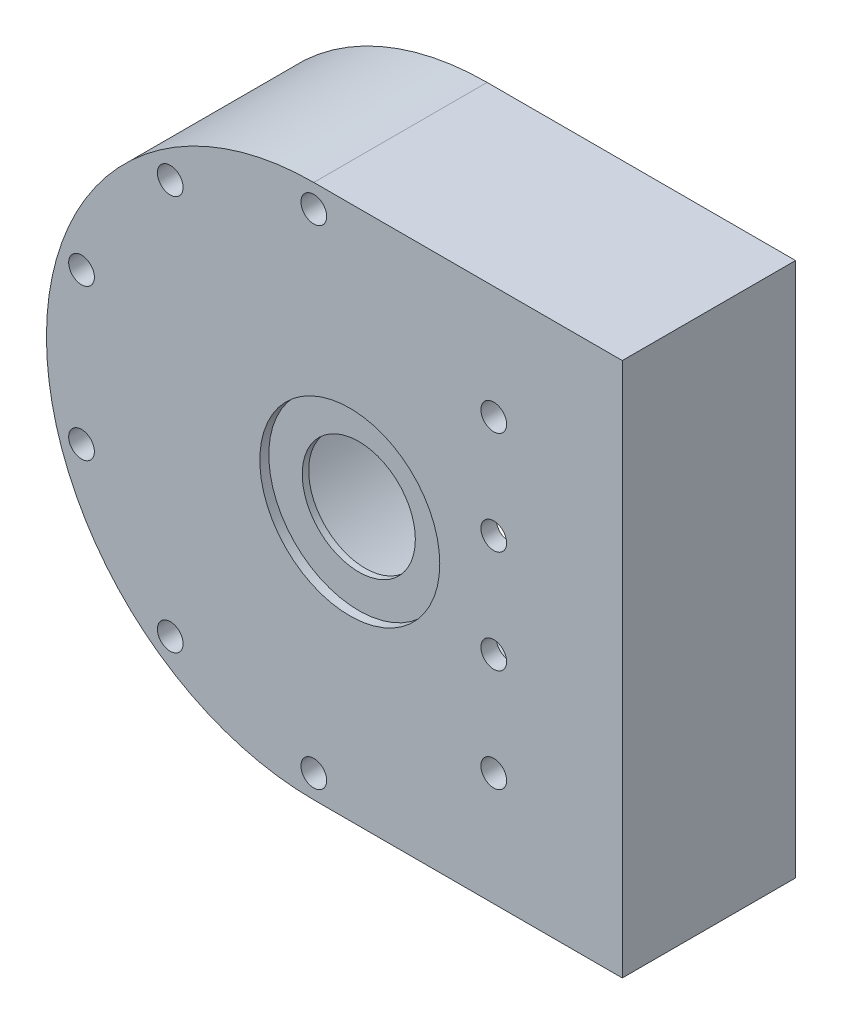
ISO-10303-21;
HEADER;
FILE_DESCRIPTION(('STEP AP214'),'2;1');
FILE_NAME('part.step','',(''),(''),'','','');
FILE_SCHEMA(('AUTOMOTIVE_DESIGN { 1 0 10303 214 1 1 1 1 }'));
ENDSEC;
DATA;
#1=APPLICATION_CONTEXT('core data for automotive mechanical design processes');
#2=APPLICATION_PROTOCOL_DEFINITION('international standard','automotive_design',2000,#1);
#3=PRODUCT_CONTEXT('',#1,'mechanical');
#4=PRODUCT('Part','Part','',(#3));
#5=PRODUCT_RELATED_PRODUCT_CATEGORY('part','',(#4));
#6=PRODUCT_DEFINITION_FORMATION('','',#4);
#7=PRODUCT_DEFINITION_CONTEXT('part definition',#1,'design');
#8=PRODUCT_DEFINITION('design','',#6,#7);
#9=PRODUCT_DEFINITION_SHAPE('','',#8);
#10=(LENGTH_UNIT() NAMED_UNIT(*) SI_UNIT(.MILLI.,.METRE.));
#11=(NAMED_UNIT(*) PLANE_ANGLE_UNIT() SI_UNIT($,.RADIAN.));
#12=(NAMED_UNIT(*) SI_UNIT($,.STERADIAN.) SOLID_ANGLE_UNIT());
#13=UNCERTAINTY_MEASURE_WITH_UNIT(LENGTH_MEASURE(1.E-05),#10,'distance_accuracy_value','');
#14=(GEOMETRIC_REPRESENTATION_CONTEXT(3) GLOBAL_UNCERTAINTY_ASSIGNED_CONTEXT((#13)) GLOBAL_UNIT_ASSIGNED_CONTEXT((#10,
#11,#12)) REPRESENTATION_CONTEXT('',''));
#15=CARTESIAN_POINT('',(0.,0.,0.));
#16=DIRECTION('',(0.,0.,1.));
#17=DIRECTION('',(1.,0.,0.));
#18=AXIS2_PLACEMENT_3D('',#15,#16,#17);
#19=CARTESIAN_POINT('',(7.,0.,30.7));
#20=DIRECTION('',(0.,0.,-1.));
#21=DIRECTION('',(-1.,0.,0.));
#22=AXIS2_PLACEMENT_3D('',#19,#20,#21);
#23=CYLINDRICAL_SURFACE('',#22,30.25);
#24=DIRECTION('',(0.,0.,1.));
#25=VECTOR('',#24,1.);
#26=CARTESIAN_POINT('',(34.5639119198585,-12.4616716243963,16.85));
#27=LINE('',#26,#25);
#28=CARTESIAN_POINT('',(34.5639119198585,-12.4616716243963,0.));
#29=VERTEX_POINT('',#28);
#30=CARTESIAN_POINT('',(34.5639119198585,-12.4616716243963,30.7));
#31=VERTEX_POINT('',#30);
#32=EDGE_CURVE('E49',#29,#31,#27,.T.);
#33=ORIENTED_EDGE('',*,*,#32,.F.);
#34=CARTESIAN_POINT('',(7.,0.,0.));
#35=DIRECTION('',(0.,0.,1.));
#36=DIRECTION('',(1.,0.,0.));
#37=AXIS2_PLACEMENT_3D('',#34,#35,#36);
#38=CIRCLE('',#37,30.25);
#39=CARTESIAN_POINT('',(34.5639119198584,12.4616716243964,0.));
#40=VERTEX_POINT('',#39);
#41=EDGE_CURVE('E113',#40,#29,#38,.T.);
#42=ORIENTED_EDGE('',*,*,#41,.F.);
#43=DIRECTION('',(0.,0.,1.));
#44=VECTOR('',#43,1.);
#45=CARTESIAN_POINT('',(34.5639119198584,12.4616716243964,16.85));
#46=LINE('',#45,#44);
#47=CARTESIAN_POINT('',(34.5639119198584,12.4616716243963,30.7));
#48=VERTEX_POINT('',#47);
#49=EDGE_CURVE('E97',#48,#40,#46,.F.);
#50=ORIENTED_EDGE('',*,*,#49,.F.);
#51=CARTESIAN_POINT('',(7.,0.,30.7));
#52=DIRECTION('',(0.,0.,1.));
#53=DIRECTION('',(1.,0.,0.));
#54=AXIS2_PLACEMENT_3D('',#51,#52,#53);
#55=CIRCLE('',#54,30.25);
#56=EDGE_CURVE('E124',#48,#31,#55,.T.);
#57=ORIENTED_EDGE('',*,*,#56,.T.);
#58=EDGE_LOOP('',(#33,#42,#50,#57));
#59=FACE_BOUND('',#58,.T.);
#60=ADVANCED_FACE('F33',(#59),#23,.F.);
#61=CARTESIAN_POINT('',(7.,0.,33.7));
#62=DIRECTION('',(0.,0.,-1.));
#63=DIRECTION('',(-1.,0.,0.));
#64=AXIS2_PLACEMENT_3D('',#61,#62,#63);
#65=CYLINDRICAL_SURFACE('',#64,11.);
#66=CARTESIAN_POINT('',(7.,0.,30.7));
#67=DIRECTION('',(0.,0.,1.));
#68=DIRECTION('',(1.,0.,0.));
#69=AXIS2_PLACEMENT_3D('',#66,#67,#68);
#70=CIRCLE('',#69,11.);
#71=CARTESIAN_POINT('',(18.,0.,30.7));
#72=VERTEX_POINT('',#71);
#73=EDGE_CURVE('E163',#72,#72,#70,.T.);
#74=ORIENTED_EDGE('',*,*,#73,.F.);
#75=EDGE_LOOP('',(#74));
#76=FACE_BOUND('',#75,.T.);
#77=CARTESIAN_POINT('',(7.,0.,31.95));
#78=DIRECTION('',(0.,0.,1.));
#79=DIRECTION('',(1.,0.,0.));
#80=AXIS2_PLACEMENT_3D('',#77,#78,#79);
#81=CIRCLE('',#80,11.);
#82=CARTESIAN_POINT('',(18.,0.,31.95));
#83=VERTEX_POINT('',#82);
#84=EDGE_CURVE('E37',#83,#83,#81,.T.);
#85=ORIENTED_EDGE('',*,*,#84,.T.);
#86=EDGE_LOOP('',(#85));
#87=FACE_BOUND('',#86,.T.);
#88=ADVANCED_FACE('F210',(#76,#87),#65,.F.);
#89=CARTESIAN_POINT('',(0.,0.,0.));
#90=DIRECTION('',(0.,0.,1.));
#91=DIRECTION('',(1.,0.,0.));
#92=AXIS2_PLACEMENT_3D('',#89,#90,#91);
#93=PLANE('',#92);
#94=CARTESIAN_POINT('',(4.5272699315819E-12,-47.5,0.));
#95=DIRECTION('',(0.,0.,1.));
#96=DIRECTION('',(1.,0.,0.));
#97=AXIS2_PLACEMENT_3D('',#94,#95,#96);
#98=CIRCLE('',#97,2.50000000000401);
#99=CARTESIAN_POINT('',(2.50000000000854,-47.5,0.));
#100=VERTEX_POINT('',#99);
#101=EDGE_CURVE('E318',#100,#100,#98,.T.);
#102=ORIENTED_EDGE('',*,*,#101,.T.);
#103=EDGE_LOOP('',(#102));
#104=FACE_BOUND('',#103,.T.);
#105=CARTESIAN_POINT('',(-27.9197994838875,-38.4283072328107,0.));
#106=DIRECTION('',(0.,0.,1.));
#107=DIRECTION('',(1.,0.,0.));
#108=AXIS2_PLACEMENT_3D('',#105,#106,#107);
#109=CIRCLE('',#108,2.50000000000472);
#110=CARTESIAN_POINT('',(-25.4197994838827,-38.4283072328107,0.));
#111=VERTEX_POINT('',#110);
#112=EDGE_CURVE('E258',#111,#111,#109,.T.);
#113=ORIENTED_EDGE('',*,*,#112,.T.);
#114=EDGE_LOOP('',(#113));
#115=FACE_BOUND('',#114,.T.);
#116=CARTESIAN_POINT('',(-45.1751845240152,-14.6783072328118,0.));
#117=DIRECTION('',(0.,0.,1.));
#118=DIRECTION('',(1.,0.,0.));
#119=AXIS2_PLACEMENT_3D('',#116,#117,#118);
#120=CIRCLE('',#119,2.50000000000396);
#121=CARTESIAN_POINT('',(-42.6751845240112,-14.6783072328118,0.));
#122=VERTEX_POINT('',#121);
#123=EDGE_CURVE('E252',#122,#122,#120,.T.);
#124=ORIENTED_EDGE('',*,*,#123,.T.);
#125=EDGE_LOOP('',(#124));
#126=FACE_BOUND('',#125,.T.);
#127=CARTESIAN_POINT('',(-45.1751845240166,14.6783072328075,0.));
#128=DIRECTION('',(0.,0.,1.));
#129=DIRECTION('',(1.,0.,0.));
#130=AXIS2_PLACEMENT_3D('',#127,#128,#129);
#131=CIRCLE('',#130,2.50000000000231);
#132=CARTESIAN_POINT('',(-42.6751845240143,14.6783072328075,0.));
#133=VERTEX_POINT('',#132);
#134=EDGE_CURVE('E246',#133,#133,#131,.T.);
#135=ORIENTED_EDGE('',*,*,#134,.T.);
#136=EDGE_LOOP('',(#135));
#137=FACE_BOUND('',#136,.T.);
#138=CARTESIAN_POINT('',(-27.9197994838911,38.428307232808,0.));
#139=DIRECTION('',(0.,0.,1.));
#140=DIRECTION('',(1.,0.,0.));
#141=AXIS2_PLACEMENT_3D('',#138,#139,#140);
#142=CIRCLE('',#141,2.5000000000007);
#143=CARTESIAN_POINT('',(-25.4197994838904,38.428307232808,0.));
#144=VERTEX_POINT('',#143);
#145=EDGE_CURVE('E240',#144,#144,#142,.T.);
#146=ORIENTED_EDGE('',*,*,#145,.T.);
#147=EDGE_LOOP('',(#146));
#148=FACE_BOUND('',#147,.T.);
#149=CARTESIAN_POINT('',(0.,47.5,0.));
#150=DIRECTION('',(0.,0.,1.));
#151=DIRECTION('',(1.,0.,0.));
#152=AXIS2_PLACEMENT_3D('',#149,#150,#151);
#153=CIRCLE('',#152,2.5);
#154=CARTESIAN_POINT('',(2.5,47.5,0.));
#155=VERTEX_POINT('',#154);
#156=EDGE_CURVE('E233',#155,#155,#153,.T.);
#157=ORIENTED_EDGE('',*,*,#156,.T.);
#158=EDGE_LOOP('',(#157));
#159=FACE_BOUND('',#158,.T.);
#160=CARTESIAN_POINT('',(35.0000000000006,-30.,0.));
#161=DIRECTION('',(0.,0.,1.));
#162=DIRECTION('',(1.,0.,0.));
#163=AXIS2_PLACEMENT_3D('',#160,#161,#162);
#164=CIRCLE('',#163,2.5);
#165=CARTESIAN_POINT('',(37.5000000000006,-30.,0.));
#166=VERTEX_POINT('',#165);
#167=EDGE_CURVE('E230',#166,#166,#164,.T.);
#168=ORIENTED_EDGE('',*,*,#167,.T.);
#169=EDGE_LOOP('',(#168));
#170=FACE_BOUND('',#169,.T.);
#171=CARTESIAN_POINT('',(35.,30.,0.));
#172=DIRECTION('',(0.,0.,1.));
#173=DIRECTION('',(1.,0.,0.));
#174=AXIS2_PLACEMENT_3D('',#171,#172,#173);
#175=CIRCLE('',#174,2.5);
#176=CARTESIAN_POINT('',(37.5,30.,0.));
#177=VERTEX_POINT('',#176);
#178=EDGE_CURVE('E259',#177,#177,#175,.T.);
#179=ORIENTED_EDGE('',*,*,#178,.T.);
#180=EDGE_LOOP('',(#179));
#181=FACE_BOUND('',#180,.T.);
#182=CARTESIAN_POINT('',(0.,0.,0.));
#183=DIRECTION('',(0.,0.,1.));
#184=DIRECTION('',(1.,0.,0.));
#185=AXIS2_PLACEMENT_3D('',#182,#183,#184);
#186=CIRCLE('',#185,52.);
#187=CARTESIAN_POINT('',(0.,52.,0.));
#188=VERTEX_POINT('',#187);
#189=CARTESIAN_POINT('',(0.,-52.,0.));
#190=VERTEX_POINT('',#189);
#191=EDGE_CURVE('E119',#188,#190,#186,.T.);
#192=ORIENTED_EDGE('',*,*,#191,.F.);
#193=DIRECTION('',(-1.,0.,0.));
#194=VECTOR('',#193,1.);
#195=CARTESIAN_POINT('',(60.,52.,0.));
#196=LINE('',#195,#194);
#197=CARTESIAN_POINT('',(60.,52.,0.));
#198=VERTEX_POINT('',#197);
#199=EDGE_CURVE('E132',#198,#188,#196,.T.);
#200=ORIENTED_EDGE('',*,*,#199,.F.);
#201=DIRECTION('',(0.,1.,0.));
#202=VECTOR('',#201,1.);
#203=CARTESIAN_POINT('',(60.,-52.,0.));
#204=LINE('',#203,#202);
#205=CARTESIAN_POINT('',(60.,-52.,0.));
#206=VERTEX_POINT('',#205);
#207=EDGE_CURVE('E130',#206,#198,#204,.T.);
#208=ORIENTED_EDGE('',*,*,#207,.F.);
#209=DIRECTION('',(1.,0.,0.));
#210=VECTOR('',#209,1.);
#211=CARTESIAN_POINT('',(0.,-52.,0.));
#212=LINE('',#211,#210);
#213=EDGE_CURVE('E122',#190,#206,#212,.T.);
#214=ORIENTED_EDGE('',*,*,#213,.F.);
#215=EDGE_LOOP('',(#192,#200,#208,#214));
#216=FACE_BOUND('',#215,.T.);
#217=ORIENTED_EDGE('',*,*,#41,.T.);
#218=CARTESIAN_POINT('',(35.0000000000004,-10.,0.));
#219=DIRECTION('',(0.,0.,1.));
#220=DIRECTION('',(1.,0.,0.));
#221=AXIS2_PLACEMENT_3D('',#218,#219,#220);
#222=CIRCLE('',#221,2.5);
#223=CARTESIAN_POINT('',(36.2220043697344,-7.81901276474367,0.));
#224=VERTEX_POINT('',#223);
#225=EDGE_CURVE('E224',#29,#224,#222,.T.);
#226=ORIENTED_EDGE('',*,*,#225,.T.);
#227=CARTESIAN_POINT('',(36.2220043697344,7.81901276474376,0.));
#228=VERTEX_POINT('',#227);
#229=EDGE_CURVE('E115',#224,#228,#38,.T.);
#230=ORIENTED_EDGE('',*,*,#229,.T.);
#231=CARTESIAN_POINT('',(35.0000000000002,10.,0.));
#232=DIRECTION('',(0.,0.,1.));
#233=DIRECTION('',(1.,0.,0.));
#234=AXIS2_PLACEMENT_3D('',#231,#232,#233);
#235=CIRCLE('',#234,2.5);
#236=EDGE_CURVE('E101',#228,#40,#235,.T.);
#237=ORIENTED_EDGE('',*,*,#236,.T.);
#238=EDGE_LOOP('',(#217,#226,#230,#237));
#239=FACE_BOUND('',#238,.T.);
#240=ADVANCED_FACE('F111',(#104,#115,#126,#137,#148,#159,#170,#181,#216,#239),#93,.F.);
#241=CARTESIAN_POINT('',(0.,0.,30.7));
#242=DIRECTION('',(0.,0.,-1.));
#243=DIRECTION('',(-1.,0.,0.));
#244=AXIS2_PLACEMENT_3D('',#241,#242,#243);
#245=CYLINDRICAL_SURFACE('',#244,52.);
#246=ORIENTED_EDGE('',*,*,#191,.T.);
#247=DIRECTION('',(0.,0.,-1.));
#248=VECTOR('',#247,1.);
#249=CARTESIAN_POINT('',(0.,-52.,30.7));
#250=LINE('',#249,#248);
#251=CARTESIAN_POINT('',(0.,-52.,33.7));
#252=VERTEX_POINT('',#251);
#253=EDGE_CURVE('E11',#252,#190,#250,.T.);
#254=ORIENTED_EDGE('',*,*,#253,.F.);
#255=CARTESIAN_POINT('',(0.,0.,33.7));
#256=DIRECTION('',(0.,0.,1.));
#257=DIRECTION('',(1.,0.,0.));
#258=AXIS2_PLACEMENT_3D('',#255,#256,#257);
#259=CIRCLE('',#258,52.);
#260=CARTESIAN_POINT('',(0.,52.,33.7));
#261=VERTEX_POINT('',#260);
#262=EDGE_CURVE('E160',#261,#252,#259,.T.);
#263=ORIENTED_EDGE('',*,*,#262,.F.);
#264=DIRECTION('',(0.,0.,-1.));
#265=VECTOR('',#264,1.);
#266=CARTESIAN_POINT('',(0.,52.,30.7));
#267=LINE('',#266,#265);
#268=EDGE_CURVE('E134',#261,#188,#267,.T.);
#269=ORIENTED_EDGE('',*,*,#268,.T.);
#270=EDGE_LOOP('',(#246,#254,#263,#269));
#271=FACE_BOUND('',#270,.T.);
#272=ADVANCED_FACE('F35',(#271),#245,.T.);
#273=CARTESIAN_POINT('',(0.,-52.,30.7));
#274=DIRECTION('',(0.,1.,0.));
#275=DIRECTION('',(0.,0.,1.));
#276=AXIS2_PLACEMENT_3D('',#273,#274,#275);
#277=PLANE('',#276);
#278=ORIENTED_EDGE('',*,*,#213,.T.);
#279=DIRECTION('',(0.,0.,-1.));
#280=VECTOR('',#279,1.);
#281=CARTESIAN_POINT('',(60.,-52.,30.7));
#282=LINE('',#281,#280);
#283=CARTESIAN_POINT('',(60.,-52.,33.7));
#284=VERTEX_POINT('',#283);
#285=EDGE_CURVE('E42',#284,#206,#282,.T.);
#286=ORIENTED_EDGE('',*,*,#285,.F.);
#287=DIRECTION('',(1.,0.,0.));
#288=VECTOR('',#287,1.);
#289=CARTESIAN_POINT('',(0.,-52.,33.7));
#290=LINE('',#289,#288);
#291=EDGE_CURVE('E162',#252,#284,#290,.T.);
#292=ORIENTED_EDGE('',*,*,#291,.F.);
#293=ORIENTED_EDGE('',*,*,#253,.T.);
#294=EDGE_LOOP('',(#278,#286,#292,#293));
#295=FACE_BOUND('',#294,.T.);
#296=ADVANCED_FACE('F352',(#295),#277,.F.);
#297=CARTESIAN_POINT('',(60.,-52.,30.7));
#298=DIRECTION('',(-1.,0.,0.));
#299=DIRECTION('',(0.,0.,1.));
#300=AXIS2_PLACEMENT_3D('',#297,#298,#299);
#301=PLANE('',#300);
#302=ORIENTED_EDGE('',*,*,#207,.T.);
#303=DIRECTION('',(0.,0.,-1.));
#304=VECTOR('',#303,1.);
#305=CARTESIAN_POINT('',(60.,52.,30.7));
#306=LINE('',#305,#304);
#307=CARTESIAN_POINT('',(60.,52.,33.7));
#308=VERTEX_POINT('',#307);
#309=EDGE_CURVE('E137',#308,#198,#306,.T.);
#310=ORIENTED_EDGE('',*,*,#309,.F.);
#311=DIRECTION('',(0.,1.,0.));
#312=VECTOR('',#311,1.);
#313=CARTESIAN_POINT('',(60.,-52.,33.7));
#314=LINE('',#313,#312);
#315=EDGE_CURVE('E146',#284,#308,#314,.T.);
#316=ORIENTED_EDGE('',*,*,#315,.F.);
#317=ORIENTED_EDGE('',*,*,#285,.T.);
#318=EDGE_LOOP('',(#302,#310,#316,#317));
#319=FACE_BOUND('',#318,.T.);
#320=ADVANCED_FACE('F144',(#319),#301,.F.);
#321=CARTESIAN_POINT('',(60.,52.,30.7));
#322=DIRECTION('',(0.,-1.,0.));
#323=DIRECTION('',(0.,0.,-1.));
#324=AXIS2_PLACEMENT_3D('',#321,#322,#323);
#325=PLANE('',#324);
#326=ORIENTED_EDGE('',*,*,#199,.T.);
#327=ORIENTED_EDGE('',*,*,#268,.F.);
#328=DIRECTION('',(-1.,0.,0.));
#329=VECTOR('',#328,1.);
#330=CARTESIAN_POINT('',(60.,52.,33.7));
#331=LINE('',#330,#329);
#332=EDGE_CURVE('E170',#308,#261,#331,.T.);
#333=ORIENTED_EDGE('',*,*,#332,.F.);
#334=ORIENTED_EDGE('',*,*,#309,.T.);
#335=EDGE_LOOP('',(#326,#327,#333,#334));
#336=FACE_BOUND('',#335,.T.);
#337=ADVANCED_FACE('F154',(#336),#325,.F.);
#338=DIRECTION('',(0.,0.,1.));
#339=VECTOR('',#338,1.);
#340=CARTESIAN_POINT('',(36.2220043697344,-7.81901276474367,16.85));
#341=LINE('',#340,#339);
#342=CARTESIAN_POINT('',(36.2220043697344,-7.81901276474368,30.7));
#343=VERTEX_POINT('',#342);
#344=EDGE_CURVE('E178',#343,#224,#341,.F.);
#345=ORIENTED_EDGE('',*,*,#344,.F.);
#346=CARTESIAN_POINT('',(36.2220043697344,7.81901276474378,30.7));
#347=VERTEX_POINT('',#346);
#348=EDGE_CURVE('E126',#343,#347,#55,.T.);
#349=ORIENTED_EDGE('',*,*,#348,.T.);
#350=DIRECTION('',(0.,0.,1.));
#351=VECTOR('',#350,1.);
#352=CARTESIAN_POINT('',(36.2220043697344,7.81901276474376,16.85));
#353=LINE('',#352,#351);
#354=EDGE_CURVE('E57',#228,#347,#353,.T.);
#355=ORIENTED_EDGE('',*,*,#354,.F.);
#356=ORIENTED_EDGE('',*,*,#229,.F.);
#357=EDGE_LOOP('',(#345,#349,#355,#356));
#358=FACE_BOUND('',#357,.T.);
#359=ADVANCED_FACE('F203',(#358),#23,.F.);
#360=CARTESIAN_POINT('',(0.,0.,30.7));
#361=DIRECTION('',(0.,0.,1.));
#362=DIRECTION('',(1.,0.,0.));
#363=AXIS2_PLACEMENT_3D('',#360,#361,#362);
#364=PLANE('',#363);
#365=ORIENTED_EDGE('',*,*,#73,.T.);
#366=EDGE_LOOP('',(#365));
#367=FACE_BOUND('',#366,.T.);
#368=ORIENTED_EDGE('',*,*,#348,.F.);
#369=CARTESIAN_POINT('',(35.0000000000004,-10.,30.7));
#370=DIRECTION('',(0.,0.,1.));
#371=DIRECTION('',(1.,0.,0.));
#372=AXIS2_PLACEMENT_3D('',#369,#370,#371);
#373=CIRCLE('',#372,2.5);
#374=EDGE_CURVE('E177',#343,#31,#373,.T.);
#375=ORIENTED_EDGE('',*,*,#374,.T.);
#376=ORIENTED_EDGE('',*,*,#56,.F.);
#377=CARTESIAN_POINT('',(35.0000000000002,10.,30.7));
#378=DIRECTION('',(0.,0.,1.));
#379=DIRECTION('',(1.,0.,0.));
#380=AXIS2_PLACEMENT_3D('',#377,#378,#379);
#381=CIRCLE('',#380,2.5);
#382=EDGE_CURVE('E102',#48,#347,#381,.T.);
#383=ORIENTED_EDGE('',*,*,#382,.T.);
#384=EDGE_LOOP('',(#368,#375,#376,#383));
#385=FACE_BOUND('',#384,.T.);
#386=ADVANCED_FACE('F176',(#367,#385),#364,.F.);
#387=CARTESIAN_POINT('',(0.,0.,33.7));
#388=DIRECTION('',(0.,0.,1.));
#389=DIRECTION('',(1.,0.,0.));
#390=AXIS2_PLACEMENT_3D('',#387,#388,#389);
#391=PLANE('',#390);
#392=CARTESIAN_POINT('',(35.0000000000004,-10.,33.7));
#393=DIRECTION('',(0.,0.,1.));
#394=DIRECTION('',(1.,0.,0.));
#395=AXIS2_PLACEMENT_3D('',#392,#393,#394);
#396=CIRCLE('',#395,2.5);
#397=CARTESIAN_POINT('',(37.5000000000004,-10.,33.7));
#398=VERTEX_POINT('',#397);
#399=EDGE_CURVE('E225',#398,#398,#396,.T.);
#400=ORIENTED_EDGE('',*,*,#399,.F.);
#401=EDGE_LOOP('',(#400));
#402=FACE_BOUND('',#401,.T.);
#403=CARTESIAN_POINT('',(35.0000000000002,10.,33.7));
#404=DIRECTION('',(0.,0.,1.));
#405=DIRECTION('',(1.,0.,0.));
#406=AXIS2_PLACEMENT_3D('',#403,#404,#405);
#407=CIRCLE('',#406,2.5);
#408=CARTESIAN_POINT('',(37.5000000000002,10.,33.7));
#409=VERTEX_POINT('',#408);
#410=EDGE_CURVE('E117',#409,#409,#407,.T.);
#411=ORIENTED_EDGE('',*,*,#410,.F.);
#412=EDGE_LOOP('',(#411));
#413=FACE_BOUND('',#412,.T.);
#414=CARTESIAN_POINT('',(4.5272699315819E-12,-47.5,33.7));
#415=DIRECTION('',(0.,0.,1.));
#416=DIRECTION('',(1.,0.,0.));
#417=AXIS2_PLACEMENT_3D('',#414,#415,#416);
#418=CIRCLE('',#417,2.50000000000401);
#419=CARTESIAN_POINT('',(2.50000000000854,-47.5,33.7));
#420=VERTEX_POINT('',#419);
#421=EDGE_CURVE('E116',#420,#420,#418,.T.);
#422=ORIENTED_EDGE('',*,*,#421,.F.);
#423=EDGE_LOOP('',(#422));
#424=FACE_BOUND('',#423,.T.);
#425=CARTESIAN_POINT('',(-27.9197994838875,-38.4283072328107,33.7));
#426=DIRECTION('',(0.,0.,1.));
#427=DIRECTION('',(1.,0.,0.));
#428=AXIS2_PLACEMENT_3D('',#425,#426,#427);
#429=CIRCLE('',#428,2.50000000000472);
#430=CARTESIAN_POINT('',(-25.4197994838827,-38.4283072328107,33.7));
#431=VERTEX_POINT('',#430);
#432=EDGE_CURVE('E316',#431,#431,#429,.T.);
#433=ORIENTED_EDGE('',*,*,#432,.F.);
#434=EDGE_LOOP('',(#433));
#435=FACE_BOUND('',#434,.T.);
#436=CARTESIAN_POINT('',(-45.1751845240152,-14.6783072328118,33.7));
#437=DIRECTION('',(0.,0.,1.));
#438=DIRECTION('',(1.,0.,0.));
#439=AXIS2_PLACEMENT_3D('',#436,#437,#438);
#440=CIRCLE('',#439,2.50000000000396);
#441=CARTESIAN_POINT('',(-42.6751845240112,-14.6783072328118,33.7));
#442=VERTEX_POINT('',#441);
#443=EDGE_CURVE('E255',#442,#442,#440,.T.);
#444=ORIENTED_EDGE('',*,*,#443,.F.);
#445=EDGE_LOOP('',(#444));
#446=FACE_BOUND('',#445,.T.);
#447=CARTESIAN_POINT('',(-45.1751845240166,14.6783072328075,33.7));
#448=DIRECTION('',(0.,0.,1.));
#449=DIRECTION('',(1.,0.,0.));
#450=AXIS2_PLACEMENT_3D('',#447,#448,#449);
#451=CIRCLE('',#450,2.50000000000231);
#452=CARTESIAN_POINT('',(-42.6751845240143,14.6783072328075,33.7));
#453=VERTEX_POINT('',#452);
#454=EDGE_CURVE('E249',#453,#453,#451,.T.);
#455=ORIENTED_EDGE('',*,*,#454,.F.);
#456=EDGE_LOOP('',(#455));
#457=FACE_BOUND('',#456,.T.);
#458=CARTESIAN_POINT('',(-27.9197994838911,38.428307232808,33.7));
#459=DIRECTION('',(0.,0.,1.));
#460=DIRECTION('',(1.,0.,0.));
#461=AXIS2_PLACEMENT_3D('',#458,#459,#460);
#462=CIRCLE('',#461,2.5000000000007);
#463=CARTESIAN_POINT('',(-25.4197994838904,38.428307232808,33.7));
#464=VERTEX_POINT('',#463);
#465=EDGE_CURVE('E243',#464,#464,#462,.T.);
#466=ORIENTED_EDGE('',*,*,#465,.F.);
#467=EDGE_LOOP('',(#466));
#468=FACE_BOUND('',#467,.T.);
#469=CARTESIAN_POINT('',(0.,47.5,33.7));
#470=DIRECTION('',(0.,0.,1.));
#471=DIRECTION('',(1.,0.,0.));
#472=AXIS2_PLACEMENT_3D('',#469,#470,#471);
#473=CIRCLE('',#472,2.5);
#474=CARTESIAN_POINT('',(2.5,47.5,33.7));
#475=VERTEX_POINT('',#474);
#476=EDGE_CURVE('E237',#475,#475,#473,.T.);
#477=ORIENTED_EDGE('',*,*,#476,.F.);
#478=EDGE_LOOP('',(#477));
#479=FACE_BOUND('',#478,.T.);
#480=CARTESIAN_POINT('',(35.0000000000006,-30.,33.7));
#481=DIRECTION('',(0.,0.,1.));
#482=DIRECTION('',(1.,0.,0.));
#483=AXIS2_PLACEMENT_3D('',#480,#481,#482);
#484=CIRCLE('',#483,2.5);
#485=CARTESIAN_POINT('',(37.5000000000006,-30.,33.7));
#486=VERTEX_POINT('',#485);
#487=EDGE_CURVE('E340',#486,#486,#484,.T.);
#488=ORIENTED_EDGE('',*,*,#487,.F.);
#489=EDGE_LOOP('',(#488));
#490=FACE_BOUND('',#489,.T.);
#491=CARTESIAN_POINT('',(35.,30.,33.7));
#492=DIRECTION('',(0.,0.,1.));
#493=DIRECTION('',(1.,0.,0.));
#494=AXIS2_PLACEMENT_3D('',#491,#492,#493);
#495=CIRCLE('',#494,2.5);
#496=CARTESIAN_POINT('',(37.5,30.,33.7));
#497=VERTEX_POINT('',#496);
#498=EDGE_CURVE('E236',#497,#497,#495,.T.);
#499=ORIENTED_EDGE('',*,*,#498,.F.);
#500=EDGE_LOOP('',(#499));
#501=FACE_BOUND('',#500,.T.);
#502=CARTESIAN_POINT('',(7.00000000000031,0.,33.7));
#503=DIRECTION('',(0.,0.,1.));
#504=DIRECTION('',(1.,0.,0.));
#505=AXIS2_PLACEMENT_3D('',#502,#503,#504);
#506=CIRCLE('',#505,17.5);
#507=CARTESIAN_POINT('',(24.5000000000003,0.,33.7));
#508=VERTEX_POINT('',#507);
#509=EDGE_CURVE('E184',#508,#508,#506,.T.);
#510=ORIENTED_EDGE('',*,*,#509,.F.);
#511=EDGE_LOOP('',(#510));
#512=FACE_BOUND('',#511,.T.);
#513=ORIENTED_EDGE('',*,*,#262,.T.);
#514=ORIENTED_EDGE('',*,*,#291,.T.);
#515=ORIENTED_EDGE('',*,*,#315,.T.);
#516=ORIENTED_EDGE('',*,*,#332,.T.);
#517=EDGE_LOOP('',(#513,#514,#515,#516));
#518=FACE_BOUND('',#517,.T.);
#519=ADVANCED_FACE('F192',(#402,#413,#424,#435,#446,#457,#468,#479,#490,#501,#512,#518),#391,.T.);
#520=CARTESIAN_POINT('',(7.00000000000031,0.,31.95));
#521=DIRECTION('',(0.,0.,1.));
#522=DIRECTION('',(1.,0.,0.));
#523=AXIS2_PLACEMENT_3D('',#520,#521,#522);
#524=CYLINDRICAL_SURFACE('',#523,17.5);
#525=CARTESIAN_POINT('',(7.00000000000031,0.,31.95));
#526=DIRECTION('',(0.,0.,1.));
#527=DIRECTION('',(1.,0.,0.));
#528=AXIS2_PLACEMENT_3D('',#525,#526,#527);
#529=CIRCLE('',#528,17.5);
#530=CARTESIAN_POINT('',(24.5000000000003,0.,31.95));
#531=VERTEX_POINT('',#530);
#532=EDGE_CURVE('E185',#531,#531,#529,.T.);
#533=ORIENTED_EDGE('',*,*,#532,.F.);
#534=EDGE_LOOP('',(#533));
#535=FACE_BOUND('',#534,.T.);
#536=ORIENTED_EDGE('',*,*,#509,.T.);
#537=EDGE_LOOP('',(#536));
#538=FACE_BOUND('',#537,.T.);
#539=ADVANCED_FACE('F190',(#535,#538),#524,.F.);
#540=CARTESIAN_POINT('',(7.00000000000031,0.,31.95));
#541=DIRECTION('',(0.,0.,1.));
#542=DIRECTION('',(1.,0.,0.));
#543=AXIS2_PLACEMENT_3D('',#540,#541,#542);
#544=PLANE('',#543);
#545=ORIENTED_EDGE('',*,*,#84,.F.);
#546=EDGE_LOOP('',(#545));
#547=FACE_BOUND('',#546,.T.);
#548=ORIENTED_EDGE('',*,*,#532,.T.);
#549=EDGE_LOOP('',(#548));
#550=FACE_BOUND('',#549,.T.);
#551=ADVANCED_FACE('F200',(#547,#550),#544,.T.);
#552=CARTESIAN_POINT('',(35.,30.,0.));
#553=DIRECTION('',(0.,0.,1.));
#554=DIRECTION('',(1.,0.,0.));
#555=AXIS2_PLACEMENT_3D('',#552,#553,#554);
#556=CYLINDRICAL_SURFACE('',#555,2.5);
#557=ORIENTED_EDGE('',*,*,#178,.F.);
#558=EDGE_LOOP('',(#557));
#559=FACE_BOUND('',#558,.T.);
#560=ORIENTED_EDGE('',*,*,#498,.T.);
#561=EDGE_LOOP('',(#560));
#562=FACE_BOUND('',#561,.T.);
#563=ADVANCED_FACE('F266',(#559,#562),#556,.F.);
#564=CARTESIAN_POINT('',(35.0000000000006,-30.,0.));
#565=DIRECTION('',(0.,0.,1.));
#566=DIRECTION('',(1.,0.,0.));
#567=AXIS2_PLACEMENT_3D('',#564,#565,#566);
#568=CYLINDRICAL_SURFACE('',#567,2.5);
#569=ORIENTED_EDGE('',*,*,#167,.F.);
#570=EDGE_LOOP('',(#569));
#571=FACE_BOUND('',#570,.T.);
#572=ORIENTED_EDGE('',*,*,#487,.T.);
#573=EDGE_LOOP('',(#572));
#574=FACE_BOUND('',#573,.T.);
#575=ADVANCED_FACE('F269',(#571,#574),#568,.F.);
#576=CARTESIAN_POINT('',(0.,47.5,0.));
#577=DIRECTION('',(0.,0.,1.));
#578=DIRECTION('',(1.,0.,0.));
#579=AXIS2_PLACEMENT_3D('',#576,#577,#578);
#580=CYLINDRICAL_SURFACE('',#579,2.5);
#581=ORIENTED_EDGE('',*,*,#156,.F.);
#582=EDGE_LOOP('',(#581));
#583=FACE_BOUND('',#582,.T.);
#584=ORIENTED_EDGE('',*,*,#476,.T.);
#585=EDGE_LOOP('',(#584));
#586=FACE_BOUND('',#585,.T.);
#587=ADVANCED_FACE('F276',(#583,#586),#580,.F.);
#588=CARTESIAN_POINT('',(-27.9197994838911,38.428307232808,0.));
#589=DIRECTION('',(0.,0.,1.));
#590=DIRECTION('',(1.,0.,0.));
#591=AXIS2_PLACEMENT_3D('',#588,#589,#590);
#592=CYLINDRICAL_SURFACE('',#591,2.5000000000007);
#593=ORIENTED_EDGE('',*,*,#145,.F.);
#594=EDGE_LOOP('',(#593));
#595=FACE_BOUND('',#594,.T.);
#596=ORIENTED_EDGE('',*,*,#465,.T.);
#597=EDGE_LOOP('',(#596));
#598=FACE_BOUND('',#597,.T.);
#599=ADVANCED_FACE('F291',(#595,#598),#592,.F.);
#600=CARTESIAN_POINT('',(-45.1751845240166,14.6783072328075,0.));
#601=DIRECTION('',(0.,0.,1.));
#602=DIRECTION('',(1.,0.,0.));
#603=AXIS2_PLACEMENT_3D('',#600,#601,#602);
#604=CYLINDRICAL_SURFACE('',#603,2.50000000000231);
#605=ORIENTED_EDGE('',*,*,#134,.F.);
#606=EDGE_LOOP('',(#605));
#607=FACE_BOUND('',#606,.T.);
#608=ORIENTED_EDGE('',*,*,#454,.T.);
#609=EDGE_LOOP('',(#608));
#610=FACE_BOUND('',#609,.T.);
#611=ADVANCED_FACE('F287',(#607,#610),#604,.F.);
#612=CARTESIAN_POINT('',(-45.1751845240152,-14.6783072328118,0.));
#613=DIRECTION('',(0.,0.,1.));
#614=DIRECTION('',(1.,0.,0.));
#615=AXIS2_PLACEMENT_3D('',#612,#613,#614);
#616=CYLINDRICAL_SURFACE('',#615,2.50000000000396);
#617=ORIENTED_EDGE('',*,*,#123,.F.);
#618=EDGE_LOOP('',(#617));
#619=FACE_BOUND('',#618,.T.);
#620=ORIENTED_EDGE('',*,*,#443,.T.);
#621=EDGE_LOOP('',(#620));
#622=FACE_BOUND('',#621,.T.);
#623=ADVANCED_FACE('F283',(#619,#622),#616,.F.);
#624=CARTESIAN_POINT('',(-27.9197994838875,-38.4283072328107,0.));
#625=DIRECTION('',(0.,0.,1.));
#626=DIRECTION('',(1.,0.,0.));
#627=AXIS2_PLACEMENT_3D('',#624,#625,#626);
#628=CYLINDRICAL_SURFACE('',#627,2.50000000000472);
#629=ORIENTED_EDGE('',*,*,#112,.F.);
#630=EDGE_LOOP('',(#629));
#631=FACE_BOUND('',#630,.T.);
#632=ORIENTED_EDGE('',*,*,#432,.T.);
#633=EDGE_LOOP('',(#632));
#634=FACE_BOUND('',#633,.T.);
#635=ADVANCED_FACE('F286',(#631,#634),#628,.F.);
#636=CARTESIAN_POINT('',(4.5272699315819E-12,-47.5,0.));
#637=DIRECTION('',(0.,0.,1.));
#638=DIRECTION('',(1.,0.,0.));
#639=AXIS2_PLACEMENT_3D('',#636,#637,#638);
#640=CYLINDRICAL_SURFACE('',#639,2.50000000000401);
#641=ORIENTED_EDGE('',*,*,#101,.F.);
#642=EDGE_LOOP('',(#641));
#643=FACE_BOUND('',#642,.T.);
#644=ORIENTED_EDGE('',*,*,#421,.T.);
#645=EDGE_LOOP('',(#644));
#646=FACE_BOUND('',#645,.T.);
#647=ADVANCED_FACE('F303',(#643,#646),#640,.F.);
#648=CARTESIAN_POINT('',(35.0000000000002,10.,0.));
#649=DIRECTION('',(0.,0.,1.));
#650=DIRECTION('',(1.,0.,0.));
#651=AXIS2_PLACEMENT_3D('',#648,#649,#650);
#652=CYLINDRICAL_SURFACE('',#651,2.5);
#653=ORIENTED_EDGE('',*,*,#354,.T.);
#654=ORIENTED_EDGE('',*,*,#382,.F.);
#655=ORIENTED_EDGE('',*,*,#49,.T.);
#656=ORIENTED_EDGE('',*,*,#236,.F.);
#657=EDGE_LOOP('',(#653,#654,#655,#656));
#658=FACE_BOUND('',#657,.T.);
#659=ORIENTED_EDGE('',*,*,#410,.T.);
#660=EDGE_LOOP('',(#659));
#661=FACE_BOUND('',#660,.T.);
#662=ADVANCED_FACE('F99',(#658,#661),#652,.F.);
#663=CARTESIAN_POINT('',(35.0000000000004,-10.,0.));
#664=DIRECTION('',(0.,0.,1.));
#665=DIRECTION('',(1.,0.,0.));
#666=AXIS2_PLACEMENT_3D('',#663,#664,#665);
#667=CYLINDRICAL_SURFACE('',#666,2.5);
#668=ORIENTED_EDGE('',*,*,#32,.T.);
#669=ORIENTED_EDGE('',*,*,#374,.F.);
#670=ORIENTED_EDGE('',*,*,#344,.T.);
#671=ORIENTED_EDGE('',*,*,#225,.F.);
#672=EDGE_LOOP('',(#668,#669,#670,#671));
#673=FACE_BOUND('',#672,.T.);
#674=ORIENTED_EDGE('',*,*,#399,.T.);
#675=EDGE_LOOP('',(#674));
#676=FACE_BOUND('',#675,.T.);
#677=ADVANCED_FACE('F222',(#673,#676),#667,.F.);
#678=CLOSED_SHELL('',(#60,#88,#240,#272,#296,#320,#337,#359,#386,#519,#539,#551,#563,#575,#587,
#599,#611,#623,#635,#647,#662,#677));
#679=MANIFOLD_SOLID_BREP('B2',#678);
#680=ADVANCED_BREP_SHAPE_REPRESENTATION('',(#18,#679),#14);
#681=SHAPE_DEFINITION_REPRESENTATION(#9,#680);
ENDSEC;
END-ISO-10303-21;
